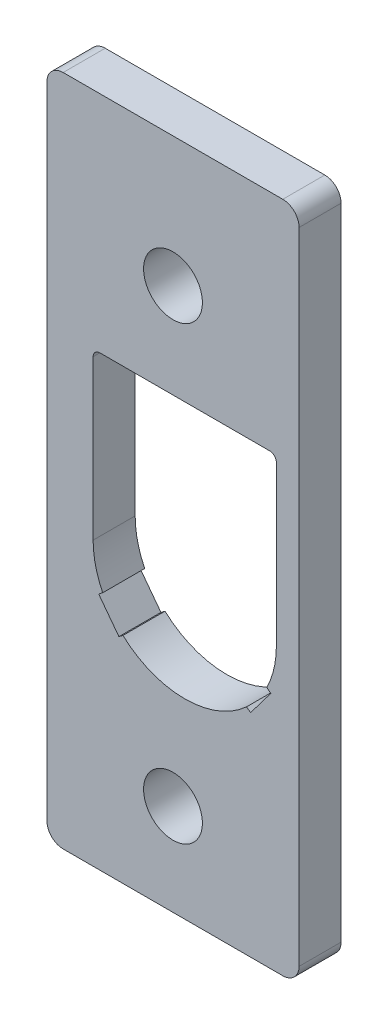
ISO-10303-21;
HEADER;
FILE_DESCRIPTION(('STEP AP214'),'2;1');
FILE_NAME('part.step','',(''),(''),'','','');
FILE_SCHEMA(('AUTOMOTIVE_DESIGN { 1 0 10303 214 1 1 1 1 }'));
ENDSEC;
DATA;
#1=APPLICATION_CONTEXT('core data for automotive mechanical design processes');
#2=APPLICATION_PROTOCOL_DEFINITION('international standard','automotive_design',2000,#1);
#3=PRODUCT_CONTEXT('',#1,'mechanical');
#4=PRODUCT('Part','Part','',(#3));
#5=PRODUCT_RELATED_PRODUCT_CATEGORY('part','',(#4));
#6=PRODUCT_DEFINITION_FORMATION('','',#4);
#7=PRODUCT_DEFINITION_CONTEXT('part definition',#1,'design');
#8=PRODUCT_DEFINITION('design','',#6,#7);
#9=PRODUCT_DEFINITION_SHAPE('','',#8);
#10=(LENGTH_UNIT() NAMED_UNIT(*) SI_UNIT(.MILLI.,.METRE.));
#11=(NAMED_UNIT(*) PLANE_ANGLE_UNIT() SI_UNIT($,.RADIAN.));
#12=(NAMED_UNIT(*) SI_UNIT($,.STERADIAN.) SOLID_ANGLE_UNIT());
#13=UNCERTAINTY_MEASURE_WITH_UNIT(LENGTH_MEASURE(1.E-05),#10,'distance_accuracy_value','');
#14=(GEOMETRIC_REPRESENTATION_CONTEXT(3) GLOBAL_UNCERTAINTY_ASSIGNED_CONTEXT((#13)) GLOBAL_UNIT_ASSIGNED_CONTEXT((#10,
#11,#12)) REPRESENTATION_CONTEXT('',''));
#15=CARTESIAN_POINT('',(0.,0.,0.));
#16=DIRECTION('',(0.,0.,1.));
#17=DIRECTION('',(1.,0.,0.));
#18=AXIS2_PLACEMENT_3D('',#15,#16,#17);
#19=CARTESIAN_POINT('',(-20.828,0.,6.35));
#20=DIRECTION('',(-1.,0.,0.));
#21=DIRECTION('',(0.,-1.,0.));
#22=AXIS2_PLACEMENT_3D('',#19,#20,#21);
#23=PLANE('',#22);
#24=DIRECTION('',(0.,1.,0.));
#25=VECTOR('',#24,1.);
#26=CARTESIAN_POINT('',(-20.828,0.,0.));
#27=LINE('',#26,#25);
#28=CARTESIAN_POINT('',(-20.828,-40.2119999999997,0.));
#29=VERTEX_POINT('',#28);
#30=CARTESIAN_POINT('',(-20.828,56.4680000000002,0.));
#31=VERTEX_POINT('',#30);
#32=EDGE_CURVE('E289',#29,#31,#27,.T.);
#33=ORIENTED_EDGE('',*,*,#32,.F.);
#34=DIRECTION('',(0.,0.,-1.));
#35=VECTOR('',#34,1.);
#36=CARTESIAN_POINT('',(-20.828,-40.2119999999997,6.35));
#37=LINE('',#36,#35);
#38=CARTESIAN_POINT('',(-20.828,-40.2119999999997,6.35));
#39=VERTEX_POINT('',#38);
#40=EDGE_CURVE('E11',#29,#39,#37,.F.);
#41=ORIENTED_EDGE('',*,*,#40,.T.);
#42=DIRECTION('',(0.,1.,0.));
#43=VECTOR('',#42,1.);
#44=CARTESIAN_POINT('',(-20.828,0.,6.35));
#45=LINE('',#44,#43);
#46=CARTESIAN_POINT('',(-20.828,56.4680000000002,6.35));
#47=VERTEX_POINT('',#46);
#48=EDGE_CURVE('E245',#39,#47,#45,.T.);
#49=ORIENTED_EDGE('',*,*,#48,.T.);
#50=DIRECTION('',(0.,0.,-1.));
#51=VECTOR('',#50,1.);
#52=CARTESIAN_POINT('',(-20.828,56.4680000000002,0.));
#53=LINE('',#52,#51);
#54=EDGE_CURVE('E45',#47,#31,#53,.T.);
#55=ORIENTED_EDGE('',*,*,#54,.T.);
#56=EDGE_LOOP('',(#33,#41,#49,#55));
#57=FACE_BOUND('',#56,.T.);
#58=ADVANCED_FACE('F37',(#57),#23,.T.);
#59=CARTESIAN_POINT('',(0.,-42.6719999999997,6.35));
#60=DIRECTION('',(0.,-1.,0.));
#61=DIRECTION('',(1.,0.,0.));
#62=AXIS2_PLACEMENT_3D('',#59,#60,#61);
#63=PLANE('',#62);
#64=DIRECTION('',(-1.,0.,0.));
#65=VECTOR('',#64,1.);
#66=CARTESIAN_POINT('',(0.,-42.6719999999997,0.));
#67=LINE('',#66,#65);
#68=CARTESIAN_POINT('',(14.8120000000001,-42.6719999999997,0.));
#69=VERTEX_POINT('',#68);
#70=CARTESIAN_POINT('',(-18.368,-42.6719999999997,0.));
#71=VERTEX_POINT('',#70);
#72=EDGE_CURVE('E292',#69,#71,#67,.T.);
#73=ORIENTED_EDGE('',*,*,#72,.F.);
#74=DIRECTION('',(0.,0.,-1.));
#75=VECTOR('',#74,1.);
#76=CARTESIAN_POINT('',(14.8120000000001,-42.6719999999997,6.35));
#77=LINE('',#76,#75);
#78=CARTESIAN_POINT('',(14.8120000000001,-42.6719999999997,6.35));
#79=VERTEX_POINT('',#78);
#80=EDGE_CURVE('E59',#69,#79,#77,.F.);
#81=ORIENTED_EDGE('',*,*,#80,.T.);
#82=DIRECTION('',(-1.,0.,0.));
#83=VECTOR('',#82,1.);
#84=CARTESIAN_POINT('',(0.,-42.6719999999997,6.35));
#85=LINE('',#84,#83);
#86=CARTESIAN_POINT('',(-18.368,-42.6719999999997,6.35));
#87=VERTEX_POINT('',#86);
#88=EDGE_CURVE('E248',#79,#87,#85,.T.);
#89=ORIENTED_EDGE('',*,*,#88,.T.);
#90=DIRECTION('',(0.,0.,-1.));
#91=VECTOR('',#90,1.);
#92=CARTESIAN_POINT('',(-18.368,-42.6719999999997,6.35));
#93=LINE('',#92,#91);
#94=EDGE_CURVE('E356',#87,#71,#93,.T.);
#95=ORIENTED_EDGE('',*,*,#94,.T.);
#96=EDGE_LOOP('',(#73,#81,#89,#95));
#97=FACE_BOUND('',#96,.T.);
#98=ADVANCED_FACE('F372',(#97),#63,.T.);
#99=CARTESIAN_POINT('',(17.2720000000001,0.,6.35));
#100=DIRECTION('',(-1.,0.,0.));
#101=DIRECTION('',(0.,0.,1.));
#102=AXIS2_PLACEMENT_3D('',#99,#100,#101);
#103=PLANE('',#102);
#104=DIRECTION('',(0.,1.,0.));
#105=VECTOR('',#104,1.);
#106=CARTESIAN_POINT('',(17.2720000000001,0.,0.));
#107=LINE('',#106,#105);
#108=CARTESIAN_POINT('',(17.2720000000001,-40.2119999999997,0.));
#109=VERTEX_POINT('',#108);
#110=CARTESIAN_POINT('',(17.2720000000001,56.4680000000003,0.));
#111=VERTEX_POINT('',#110);
#112=EDGE_CURVE('E215',#109,#111,#107,.T.);
#113=ORIENTED_EDGE('',*,*,#112,.T.);
#114=DIRECTION('',(0.,0.,-1.));
#115=VECTOR('',#114,1.);
#116=CARTESIAN_POINT('',(17.2720000000001,56.4680000000003,6.35));
#117=LINE('',#116,#115);
#118=CARTESIAN_POINT('',(17.2720000000001,56.4680000000003,6.35));
#119=VERTEX_POINT('',#118);
#120=EDGE_CURVE('E347',#111,#119,#117,.F.);
#121=ORIENTED_EDGE('',*,*,#120,.T.);
#122=DIRECTION('',(0.,1.,0.));
#123=VECTOR('',#122,1.);
#124=CARTESIAN_POINT('',(17.2720000000001,0.,6.35));
#125=LINE('',#124,#123);
#126=CARTESIAN_POINT('',(17.2720000000001,-40.2119999999997,6.35));
#127=VERTEX_POINT('',#126);
#128=EDGE_CURVE('E250',#127,#119,#125,.T.);
#129=ORIENTED_EDGE('',*,*,#128,.F.);
#130=DIRECTION('',(0.,0.,-1.));
#131=VECTOR('',#130,1.);
#132=CARTESIAN_POINT('',(17.2720000000001,-40.2119999999997,0.));
#133=LINE('',#132,#131);
#134=EDGE_CURVE('E344',#127,#109,#133,.T.);
#135=ORIENTED_EDGE('',*,*,#134,.T.);
#136=EDGE_LOOP('',(#113,#121,#129,#135));
#137=FACE_BOUND('',#136,.T.);
#138=ADVANCED_FACE('F380',(#137),#103,.F.);
#139=CARTESIAN_POINT('',(0.,0.,6.35));
#140=DIRECTION('',(0.,0.,-1.));
#141=DIRECTION('',(-1.,0.,0.));
#142=AXIS2_PLACEMENT_3D('',#139,#140,#141);
#143=CYLINDRICAL_SURFACE('',#142,13.843);
#144=CARTESIAN_POINT('',(0.,0.,0.));
#145=DIRECTION('',(0.,0.,1.));
#146=DIRECTION('',(1.,0.,0.));
#147=AXIS2_PLACEMENT_3D('',#144,#145,#146);
#148=CIRCLE('',#147,13.843);
#149=CARTESIAN_POINT('',(12.3964241327467,-6.16095104030657,0.));
#150=VERTEX_POINT('',#149);
#151=CARTESIAN_POINT('',(13.843,0.,0.));
#152=VERTEX_POINT('',#151);
#153=EDGE_CURVE('E194',#150,#152,#148,.T.);
#154=ORIENTED_EDGE('',*,*,#153,.F.);
#155=DIRECTION('',(0.,0.,-1.));
#156=VECTOR('',#155,1.);
#157=CARTESIAN_POINT('',(12.3964241327467,-6.16095104030657,6.35));
#158=LINE('',#157,#156);
#159=CARTESIAN_POINT('',(12.3964241327467,-6.16095104030657,6.35));
#160=VERTEX_POINT('',#159);
#161=EDGE_CURVE('E187',#160,#150,#158,.T.);
#162=ORIENTED_EDGE('',*,*,#161,.F.);
#163=CARTESIAN_POINT('',(0.,0.,6.35));
#164=DIRECTION('',(0.,0.,1.));
#165=DIRECTION('',(1.,0.,0.));
#166=AXIS2_PLACEMENT_3D('',#163,#164,#165);
#167=CIRCLE('',#166,13.843);
#168=CARTESIAN_POINT('',(13.843,0.,6.35));
#169=VERTEX_POINT('',#168);
#170=EDGE_CURVE('E191',#160,#169,#167,.T.);
#171=ORIENTED_EDGE('',*,*,#170,.T.);
#172=DIRECTION('',(0.,0.,-1.));
#173=VECTOR('',#172,1.);
#174=CARTESIAN_POINT('',(13.843,0.,6.35));
#175=LINE('',#174,#173);
#176=EDGE_CURVE('E256',#169,#152,#175,.T.);
#177=ORIENTED_EDGE('',*,*,#176,.T.);
#178=EDGE_LOOP('',(#154,#162,#171,#177));
#179=FACE_BOUND('',#178,.T.);
#180=ADVANCED_FACE('F189',(#179),#143,.F.);
#181=CARTESIAN_POINT('',(1.52861015881476,2.02853419552793,6.35));
#182=DIRECTION('',(0.60181502315272,0.798635510046787,0.));
#183=DIRECTION('',(-0.798635510046787,0.60181502315272,0.));
#184=AXIS2_PLACEMENT_3D('',#181,#182,#183);
#185=PLANE('',#184);
#186=DIRECTION('',(0.798635510046787,-0.60181502315272,0.));
#187=VECTOR('',#186,1.);
#188=CARTESIAN_POINT('',(1.52861015881476,2.02853419552793,0.));
#189=LINE('',#188,#187);
#190=CARTESIAN_POINT('',(13.0049843914024,-6.61953408794895,0.));
#191=VERTEX_POINT('',#190);
#192=EDGE_CURVE('E258',#150,#191,#189,.T.);
#193=ORIENTED_EDGE('',*,*,#192,.T.);
#194=DIRECTION('',(0.,0.,-1.));
#195=VECTOR('',#194,1.);
#196=CARTESIAN_POINT('',(13.0049843914024,-6.61953408794895,6.35));
#197=LINE('',#196,#195);
#198=CARTESIAN_POINT('',(13.0049843914024,-6.61953408794895,6.35));
#199=VERTEX_POINT('',#198);
#200=EDGE_CURVE('E199',#199,#191,#197,.T.);
#201=ORIENTED_EDGE('',*,*,#200,.F.);
#202=DIRECTION('',(0.798635510046787,-0.60181502315272,0.));
#203=VECTOR('',#202,1.);
#204=CARTESIAN_POINT('',(1.52861015881476,2.02853419552793,6.35));
#205=LINE('',#204,#203);
#206=EDGE_CURVE('E202',#160,#199,#205,.T.);
#207=ORIENTED_EDGE('',*,*,#206,.F.);
#208=ORIENTED_EDGE('',*,*,#161,.T.);
#209=EDGE_LOOP('',(#193,#201,#207,#208));
#210=FACE_BOUND('',#209,.T.);
#211=ADVANCED_FACE('F203',(#210),#185,.F.);
#212=CARTESIAN_POINT('',(11.4763742325965,-8.64806828346858,6.35));
#213=DIRECTION('',(-0.798635510047289,0.601815023152054,0.));
#214=DIRECTION('',(-0.601815023152054,-0.798635510047289,0.));
#215=AXIS2_PLACEMENT_3D('',#212,#213,#214);
#216=PLANE('',#215);
#217=DIRECTION('',(0.601815023152054,0.798635510047289,0.));
#218=VECTOR('',#217,1.);
#219=CARTESIAN_POINT('',(11.4763742325965,-8.64806828346858,0.));
#220=LINE('',#219,#218);
#221=CARTESIAN_POINT('',(9.94776407378995,-10.6766024789892,0.));
#222=VERTEX_POINT('',#221);
#223=EDGE_CURVE('E260',#222,#191,#220,.T.);
#224=ORIENTED_EDGE('',*,*,#223,.F.);
#225=DIRECTION('',(0.,0.,-1.));
#226=VECTOR('',#225,1.);
#227=CARTESIAN_POINT('',(9.94776407378995,-10.6766024789892,6.35));
#228=LINE('',#227,#226);
#229=CARTESIAN_POINT('',(9.94776407378995,-10.6766024789892,6.35));
#230=VERTEX_POINT('',#229);
#231=EDGE_CURVE('E311',#230,#222,#228,.T.);
#232=ORIENTED_EDGE('',*,*,#231,.F.);
#233=DIRECTION('',(0.601815023152054,0.798635510047289,0.));
#234=VECTOR('',#233,1.);
#235=CARTESIAN_POINT('',(11.4763742325965,-8.64806828346858,6.35));
#236=LINE('',#235,#234);
#237=EDGE_CURVE('E207',#230,#199,#236,.T.);
#238=ORIENTED_EDGE('',*,*,#237,.T.);
#239=ORIENTED_EDGE('',*,*,#200,.T.);
#240=EDGE_LOOP('',(#224,#232,#238,#239));
#241=FACE_BOUND('',#240,.T.);
#242=ADVANCED_FACE('F437',(#241),#216,.T.);
#243=CARTESIAN_POINT('',(-1.52861015880656,-2.02853419552056,6.35));
#244=DIRECTION('',(0.601815023152056,0.798635510047287,0.));
#245=DIRECTION('',(-0.798635510047287,0.601815023152056,0.));
#246=AXIS2_PLACEMENT_3D('',#243,#244,#245);
#247=PLANE('',#246);
#248=DIRECTION('',(0.798635510047287,-0.601815023152056,0.));
#249=VECTOR('',#248,1.);
#250=CARTESIAN_POINT('',(-1.52861015880656,-2.02853419552056,0.));
#251=LINE('',#250,#249);
#252=CARTESIAN_POINT('',(9.33920381513392,-10.2180194313473,0.));
#253=VERTEX_POINT('',#252);
#254=EDGE_CURVE('E263',#253,#222,#251,.T.);
#255=ORIENTED_EDGE('',*,*,#254,.F.);
#256=DIRECTION('',(0.,0.,-1.));
#257=VECTOR('',#256,1.);
#258=CARTESIAN_POINT('',(9.33920381513392,-10.2180194313473,6.35));
#259=LINE('',#258,#257);
#260=CARTESIAN_POINT('',(9.33920381513392,-10.2180194313473,6.35));
#261=VERTEX_POINT('',#260);
#262=EDGE_CURVE('E309',#261,#253,#259,.T.);
#263=ORIENTED_EDGE('',*,*,#262,.F.);
#264=DIRECTION('',(0.798635510047287,-0.601815023152056,0.));
#265=VECTOR('',#264,1.);
#266=CARTESIAN_POINT('',(-1.52861015880656,-2.02853419552056,6.35));
#267=LINE('',#266,#265);
#268=EDGE_CURVE('E222',#261,#230,#267,.T.);
#269=ORIENTED_EDGE('',*,*,#268,.T.);
#270=ORIENTED_EDGE('',*,*,#231,.T.);
#271=EDGE_LOOP('',(#255,#263,#269,#270));
#272=FACE_BOUND('',#271,.T.);
#273=ADVANCED_FACE('F433',(#272),#247,.T.);
#274=CARTESIAN_POINT('',(0.,0.,6.35));
#275=DIRECTION('',(0.,0.,-1.));
#276=DIRECTION('',(-1.,0.,0.));
#277=AXIS2_PLACEMENT_3D('',#274,#275,#276);
#278=CYLINDRICAL_SURFACE('',#277,13.8430000000001);
#279=CARTESIAN_POINT('',(0.,0.,0.));
#280=DIRECTION('',(0.,0.,1.));
#281=DIRECTION('',(1.,0.,0.));
#282=AXIS2_PLACEMENT_3D('',#279,#280,#281);
#283=CIRCLE('',#282,13.8430000000001);
#284=CARTESIAN_POINT('',(-9.33920381513427,-10.2180194313468,0.));
#285=VERTEX_POINT('',#284);
#286=EDGE_CURVE('E266',#285,#253,#283,.T.);
#287=ORIENTED_EDGE('',*,*,#286,.F.);
#288=DIRECTION('',(0.,0.,-1.));
#289=VECTOR('',#288,1.);
#290=CARTESIAN_POINT('',(-9.33920381513427,-10.2180194313468,6.35));
#291=LINE('',#290,#289);
#292=CARTESIAN_POINT('',(-9.33920381513427,-10.2180194313468,6.35));
#293=VERTEX_POINT('',#292);
#294=EDGE_CURVE('E307',#293,#285,#291,.T.);
#295=ORIENTED_EDGE('',*,*,#294,.F.);
#296=CARTESIAN_POINT('',(0.,0.,6.35));
#297=DIRECTION('',(0.,0.,1.));
#298=DIRECTION('',(1.,0.,0.));
#299=AXIS2_PLACEMENT_3D('',#296,#297,#298);
#300=CIRCLE('',#299,13.8430000000001);
#301=EDGE_CURVE('E225',#293,#261,#300,.T.);
#302=ORIENTED_EDGE('',*,*,#301,.T.);
#303=ORIENTED_EDGE('',*,*,#262,.T.);
#304=EDGE_LOOP('',(#287,#295,#302,#303));
#305=FACE_BOUND('',#304,.T.);
#306=ADVANCED_FACE('F429',(#305),#278,.F.);
#307=CARTESIAN_POINT('',(1.52861015880624,-2.02853419552015,6.35));
#308=DIRECTION('',(0.601815023152052,-0.79863551004729,0.));
#309=DIRECTION('',(0.79863551004729,0.601815023152052,0.));
#310=AXIS2_PLACEMENT_3D('',#307,#308,#309);
#311=PLANE('',#310);
#312=DIRECTION('',(-0.79863551004729,-0.601815023152052,0.));
#313=VECTOR('',#312,1.);
#314=CARTESIAN_POINT('',(1.52861015880624,-2.02853419552015,0.));
#315=LINE('',#314,#313);
#316=CARTESIAN_POINT('',(-9.9477640737903,-10.6766024789887,0.));
#317=VERTEX_POINT('',#316);
#318=EDGE_CURVE('E269',#285,#317,#315,.T.);
#319=ORIENTED_EDGE('',*,*,#318,.T.);
#320=DIRECTION('',(0.,0.,-1.));
#321=VECTOR('',#320,1.);
#322=CARTESIAN_POINT('',(-9.9477640737903,-10.6766024789887,6.35));
#323=LINE('',#322,#321);
#324=CARTESIAN_POINT('',(-9.9477640737903,-10.6766024789887,6.35));
#325=VERTEX_POINT('',#324);
#326=EDGE_CURVE('E305',#325,#317,#323,.T.);
#327=ORIENTED_EDGE('',*,*,#326,.F.);
#328=DIRECTION('',(-0.79863551004729,-0.601815023152052,0.));
#329=VECTOR('',#328,1.);
#330=CARTESIAN_POINT('',(1.52861015880624,-2.02853419552015,6.35));
#331=LINE('',#330,#329);
#332=EDGE_CURVE('E228',#293,#325,#331,.T.);
#333=ORIENTED_EDGE('',*,*,#332,.F.);
#334=ORIENTED_EDGE('',*,*,#294,.T.);
#335=EDGE_LOOP('',(#319,#327,#333,#334));
#336=FACE_BOUND('',#335,.T.);
#337=ADVANCED_FACE('F425',(#336),#311,.F.);
#338=CARTESIAN_POINT('',(-11.4763742325965,-8.64806828346857,6.35));
#339=DIRECTION('',(0.798635510047289,0.601815023152053,0.));
#340=DIRECTION('',(-0.601815023152053,0.798635510047289,0.));
#341=AXIS2_PLACEMENT_3D('',#338,#339,#340);
#342=PLANE('',#341);
#343=DIRECTION('',(0.601815023152053,-0.798635510047289,0.));
#344=VECTOR('',#343,1.);
#345=CARTESIAN_POINT('',(-11.4763742325965,-8.64806828346857,0.));
#346=LINE('',#345,#344);
#347=CARTESIAN_POINT('',(-13.0049843914027,-6.61953408794847,0.));
#348=VERTEX_POINT('',#347);
#349=EDGE_CURVE('E272',#348,#317,#346,.T.);
#350=ORIENTED_EDGE('',*,*,#349,.F.);
#351=DIRECTION('',(0.,0.,-1.));
#352=VECTOR('',#351,1.);
#353=CARTESIAN_POINT('',(-13.0049843914027,-6.61953408794847,6.35));
#354=LINE('',#353,#352);
#355=CARTESIAN_POINT('',(-13.0049843914027,-6.61953408794847,6.35));
#356=VERTEX_POINT('',#355);
#357=EDGE_CURVE('E303',#356,#348,#354,.T.);
#358=ORIENTED_EDGE('',*,*,#357,.F.);
#359=DIRECTION('',(0.601815023152053,-0.798635510047289,0.));
#360=VECTOR('',#359,1.);
#361=CARTESIAN_POINT('',(-11.4763742325965,-8.64806828346857,6.35));
#362=LINE('',#361,#360);
#363=EDGE_CURVE('E230',#356,#325,#362,.T.);
#364=ORIENTED_EDGE('',*,*,#363,.T.);
#365=ORIENTED_EDGE('',*,*,#326,.T.);
#366=EDGE_LOOP('',(#350,#358,#364,#365));
#367=FACE_BOUND('',#366,.T.);
#368=ADVANCED_FACE('F421',(#367),#342,.T.);
#369=CARTESIAN_POINT('',(-1.5286101588062,2.02853419552009,6.35));
#370=DIRECTION('',(0.601815023152053,-0.798635510047289,0.));
#371=DIRECTION('',(0.79863551004729,0.601815023152053,0.));
#372=AXIS2_PLACEMENT_3D('',#369,#370,#371);
#373=PLANE('',#372);
#374=DIRECTION('',(-0.798635510047289,-0.601815023152053,0.));
#375=VECTOR('',#374,1.);
#376=CARTESIAN_POINT('',(-1.5286101588062,2.02853419552009,0.));
#377=LINE('',#376,#375);
#378=CARTESIAN_POINT('',(-12.3964241327467,-6.16095104030661,0.));
#379=VERTEX_POINT('',#378);
#380=EDGE_CURVE('E275',#379,#348,#377,.T.);
#381=ORIENTED_EDGE('',*,*,#380,.F.);
#382=DIRECTION('',(0.,0.,-1.));
#383=VECTOR('',#382,1.);
#384=CARTESIAN_POINT('',(-12.3964241327467,-6.16095104030661,6.35));
#385=LINE('',#384,#383);
#386=CARTESIAN_POINT('',(-12.3964241327467,-6.16095104030661,6.35));
#387=VERTEX_POINT('',#386);
#388=EDGE_CURVE('E301',#387,#379,#385,.T.);
#389=ORIENTED_EDGE('',*,*,#388,.F.);
#390=DIRECTION('',(-0.798635510047289,-0.601815023152053,0.));
#391=VECTOR('',#390,1.);
#392=CARTESIAN_POINT('',(-1.5286101588062,2.02853419552009,6.35));
#393=LINE('',#392,#391);
#394=EDGE_CURVE('E233',#387,#356,#393,.T.);
#395=ORIENTED_EDGE('',*,*,#394,.T.);
#396=ORIENTED_EDGE('',*,*,#357,.T.);
#397=EDGE_LOOP('',(#381,#389,#395,#396));
#398=FACE_BOUND('',#397,.T.);
#399=ADVANCED_FACE('F417',(#398),#373,.T.);
#400=CARTESIAN_POINT('',(0.,0.,6.35));
#401=DIRECTION('',(0.,0.,-1.));
#402=DIRECTION('',(-1.,0.,0.));
#403=AXIS2_PLACEMENT_3D('',#400,#401,#402);
#404=CYLINDRICAL_SURFACE('',#403,13.843);
#405=CARTESIAN_POINT('',(0.,0.,0.));
#406=DIRECTION('',(0.,0.,1.));
#407=DIRECTION('',(1.,0.,0.));
#408=AXIS2_PLACEMENT_3D('',#405,#406,#407);
#409=CIRCLE('',#408,13.843);
#410=CARTESIAN_POINT('',(-13.843,0.,0.));
#411=VERTEX_POINT('',#410);
#412=EDGE_CURVE('E278',#411,#379,#409,.T.);
#413=ORIENTED_EDGE('',*,*,#412,.F.);
#414=DIRECTION('',(0.,0.,-1.));
#415=VECTOR('',#414,1.);
#416=CARTESIAN_POINT('',(-13.843,0.,6.35));
#417=LINE('',#416,#415);
#418=CARTESIAN_POINT('',(-13.843,0.,6.35));
#419=VERTEX_POINT('',#418);
#420=EDGE_CURVE('E298',#419,#411,#417,.T.);
#421=ORIENTED_EDGE('',*,*,#420,.F.);
#422=CARTESIAN_POINT('',(0.,0.,6.35));
#423=DIRECTION('',(0.,0.,1.));
#424=DIRECTION('',(1.,0.,0.));
#425=AXIS2_PLACEMENT_3D('',#422,#423,#424);
#426=CIRCLE('',#425,13.843);
#427=EDGE_CURVE('E236',#419,#387,#426,.T.);
#428=ORIENTED_EDGE('',*,*,#427,.T.);
#429=ORIENTED_EDGE('',*,*,#388,.T.);
#430=EDGE_LOOP('',(#413,#421,#428,#429));
#431=FACE_BOUND('',#430,.T.);
#432=ADVANCED_FACE('F413',(#431),#404,.F.);
#433=CARTESIAN_POINT('',(-13.843,0.,6.35));
#434=DIRECTION('',(1.,0.,0.));
#435=DIRECTION('',(0.,1.,0.));
#436=AXIS2_PLACEMENT_3D('',#433,#434,#435);
#437=PLANE('',#436);
#438=DIRECTION('',(0.,-1.,0.));
#439=VECTOR('',#438,1.);
#440=CARTESIAN_POINT('',(-13.843,0.,0.));
#441=LINE('',#440,#439);
#442=CARTESIAN_POINT('',(-13.843,24.003,0.));
#443=VERTEX_POINT('',#442);
#444=EDGE_CURVE('E281',#443,#411,#441,.T.);
#445=ORIENTED_EDGE('',*,*,#444,.F.);
#446=DIRECTION('',(0.,0.,-1.));
#447=VECTOR('',#446,1.);
#448=CARTESIAN_POINT('',(-13.843,24.003,6.35));
#449=LINE('',#448,#447);
#450=CARTESIAN_POINT('',(-13.843,24.003,6.35));
#451=VERTEX_POINT('',#450);
#452=EDGE_CURVE('E321',#443,#451,#449,.F.);
#453=ORIENTED_EDGE('',*,*,#452,.T.);
#454=DIRECTION('',(0.,-1.,0.));
#455=VECTOR('',#454,1.);
#456=CARTESIAN_POINT('',(-13.843,0.,6.35));
#457=LINE('',#456,#455);
#458=EDGE_CURVE('E239',#451,#419,#457,.T.);
#459=ORIENTED_EDGE('',*,*,#458,.T.);
#460=ORIENTED_EDGE('',*,*,#420,.T.);
#461=EDGE_LOOP('',(#445,#453,#459,#460));
#462=FACE_BOUND('',#461,.T.);
#463=ADVANCED_FACE('F409',(#462),#437,.T.);
#464=CARTESIAN_POINT('',(0.,25.019,6.35));
#465=DIRECTION('',(0.,1.,0.));
#466=DIRECTION('',(-1.,0.,0.));
#467=AXIS2_PLACEMENT_3D('',#464,#465,#466);
#468=PLANE('',#467);
#469=DIRECTION('',(1.,0.,0.));
#470=VECTOR('',#469,1.);
#471=CARTESIAN_POINT('',(0.,25.019,0.));
#472=LINE('',#471,#470);
#473=CARTESIAN_POINT('',(-12.827,25.019,0.));
#474=VERTEX_POINT('',#473);
#475=CARTESIAN_POINT('',(12.827,25.019,0.));
#476=VERTEX_POINT('',#475);
#477=EDGE_CURVE('E283',#474,#476,#472,.T.);
#478=ORIENTED_EDGE('',*,*,#477,.T.);
#479=DIRECTION('',(0.,0.,-1.));
#480=VECTOR('',#479,1.);
#481=CARTESIAN_POINT('',(12.827,25.019,6.35));
#482=LINE('',#481,#480);
#483=CARTESIAN_POINT('',(12.827,25.019,6.35));
#484=VERTEX_POINT('',#483);
#485=EDGE_CURVE('E319',#476,#484,#482,.F.);
#486=ORIENTED_EDGE('',*,*,#485,.T.);
#487=DIRECTION('',(1.,0.,0.));
#488=VECTOR('',#487,1.);
#489=CARTESIAN_POINT('',(0.,25.019,6.35));
#490=LINE('',#489,#488);
#491=CARTESIAN_POINT('',(-12.827,25.019,6.35));
#492=VERTEX_POINT('',#491);
#493=EDGE_CURVE('E241',#492,#484,#490,.T.);
#494=ORIENTED_EDGE('',*,*,#493,.F.);
#495=DIRECTION('',(0.,0.,-1.));
#496=VECTOR('',#495,1.);
#497=CARTESIAN_POINT('',(-12.827,25.019,6.35));
#498=LINE('',#497,#496);
#499=EDGE_CURVE('E316',#492,#474,#498,.T.);
#500=ORIENTED_EDGE('',*,*,#499,.T.);
#501=EDGE_LOOP('',(#478,#486,#494,#500));
#502=FACE_BOUND('',#501,.T.);
#503=ADVANCED_FACE('F405',(#502),#468,.F.);
#504=CARTESIAN_POINT('',(13.843,0.,6.35));
#505=DIRECTION('',(-1.,0.,0.));
#506=DIRECTION('',(0.,-1.,0.));
#507=AXIS2_PLACEMENT_3D('',#504,#505,#506);
#508=PLANE('',#507);
#509=DIRECTION('',(0.,1.,0.));
#510=VECTOR('',#509,1.);
#511=CARTESIAN_POINT('',(13.843,0.,6.35));
#512=LINE('',#511,#510);
#513=CARTESIAN_POINT('',(13.843,24.003,6.35));
#514=VERTEX_POINT('',#513);
#515=EDGE_CURVE('E211',#169,#514,#512,.T.);
#516=ORIENTED_EDGE('',*,*,#515,.T.);
#517=DIRECTION('',(0.,0.,-1.));
#518=VECTOR('',#517,1.);
#519=CARTESIAN_POINT('',(13.843,24.003,6.35));
#520=LINE('',#519,#518);
#521=CARTESIAN_POINT('',(13.843,24.003,0.));
#522=VERTEX_POINT('',#521);
#523=EDGE_CURVE('E198',#514,#522,#520,.T.);
#524=ORIENTED_EDGE('',*,*,#523,.T.);
#525=DIRECTION('',(0.,1.,0.));
#526=VECTOR('',#525,1.);
#527=CARTESIAN_POINT('',(13.843,0.,0.));
#528=LINE('',#527,#526);
#529=EDGE_CURVE('E286',#152,#522,#528,.T.);
#530=ORIENTED_EDGE('',*,*,#529,.F.);
#531=ORIENTED_EDGE('',*,*,#176,.F.);
#532=EDGE_LOOP('',(#516,#524,#530,#531));
#533=FACE_BOUND('',#532,.T.);
#534=ADVANCED_FACE('F402',(#533),#508,.T.);
#535=CARTESIAN_POINT('',(0.,58.9280000000003,6.35));
#536=DIRECTION('',(0.,-1.,0.));
#537=DIRECTION('',(1.,0.,0.));
#538=AXIS2_PLACEMENT_3D('',#535,#536,#537);
#539=PLANE('',#538);
#540=DIRECTION('',(-1.,0.,0.));
#541=VECTOR('',#540,1.);
#542=CARTESIAN_POINT('',(0.,58.9280000000003,6.35));
#543=LINE('',#542,#541);
#544=CARTESIAN_POINT('',(14.8120000000001,58.9280000000003,6.35));
#545=VERTEX_POINT('',#544);
#546=CARTESIAN_POINT('',(-18.368,58.9280000000002,6.35));
#547=VERTEX_POINT('',#546);
#548=EDGE_CURVE('E253',#545,#547,#543,.T.);
#549=ORIENTED_EDGE('',*,*,#548,.F.);
#550=DIRECTION('',(0.,0.,-1.));
#551=VECTOR('',#550,1.);
#552=CARTESIAN_POINT('',(14.8120000000001,58.9280000000003,6.35));
#553=LINE('',#552,#551);
#554=CARTESIAN_POINT('',(14.8120000000001,58.9280000000003,0.));
#555=VERTEX_POINT('',#554);
#556=EDGE_CURVE('E333',#545,#555,#553,.T.);
#557=ORIENTED_EDGE('',*,*,#556,.T.);
#558=DIRECTION('',(-1.,0.,0.));
#559=VECTOR('',#558,1.);
#560=CARTESIAN_POINT('',(0.,58.9280000000003,0.));
#561=LINE('',#560,#559);
#562=CARTESIAN_POINT('',(-18.368,58.9280000000002,0.));
#563=VERTEX_POINT('',#562);
#564=EDGE_CURVE('E212',#555,#563,#561,.T.);
#565=ORIENTED_EDGE('',*,*,#564,.T.);
#566=DIRECTION('',(0.,0.,-1.));
#567=VECTOR('',#566,1.);
#568=CARTESIAN_POINT('',(-18.368,58.9280000000002,6.35));
#569=LINE('',#568,#567);
#570=EDGE_CURVE('E331',#563,#547,#569,.F.);
#571=ORIENTED_EDGE('',*,*,#570,.T.);
#572=EDGE_LOOP('',(#549,#557,#565,#571));
#573=FACE_BOUND('',#572,.T.);
#574=ADVANCED_FACE('F388',(#573),#539,.F.);
#575=CARTESIAN_POINT('',(0.,0.,6.35));
#576=DIRECTION('',(0.,0.,1.));
#577=DIRECTION('',(1.,0.,0.));
#578=AXIS2_PLACEMENT_3D('',#575,#576,#577);
#579=PLANE('',#578);
#580=CARTESIAN_POINT('',(-1.77799999999995,-28.7813749999997,6.35));
#581=DIRECTION('',(0.,0.,1.));
#582=DIRECTION('',(1.,0.,0.));
#583=AXIS2_PLACEMENT_3D('',#580,#581,#582);
#584=CIRCLE('',#583,4.445);
#585=CARTESIAN_POINT('',(2.66700000000005,-28.7813749999997,6.35));
#586=VERTEX_POINT('',#585);
#587=EDGE_CURVE('E632',#586,#586,#584,.T.);
#588=ORIENTED_EDGE('',*,*,#587,.F.);
#589=EDGE_LOOP('',(#588));
#590=FACE_BOUND('',#589,.T.);
#591=CARTESIAN_POINT('',(-1.77799999999995,39.3223750000002,6.35));
#592=DIRECTION('',(0.,0.,1.));
#593=DIRECTION('',(1.,0.,0.));
#594=AXIS2_PLACEMENT_3D('',#591,#592,#593);
#595=CIRCLE('',#594,4.445);
#596=CARTESIAN_POINT('',(2.66700000000005,39.3223750000002,6.35));
#597=VERTEX_POINT('',#596);
#598=EDGE_CURVE('E635',#597,#597,#595,.T.);
#599=ORIENTED_EDGE('',*,*,#598,.F.);
#600=EDGE_LOOP('',(#599));
#601=FACE_BOUND('',#600,.T.);
#602=ORIENTED_EDGE('',*,*,#170,.F.);
#603=ORIENTED_EDGE('',*,*,#206,.T.);
#604=ORIENTED_EDGE('',*,*,#237,.F.);
#605=ORIENTED_EDGE('',*,*,#268,.F.);
#606=ORIENTED_EDGE('',*,*,#301,.F.);
#607=ORIENTED_EDGE('',*,*,#332,.T.);
#608=ORIENTED_EDGE('',*,*,#363,.F.);
#609=ORIENTED_EDGE('',*,*,#394,.F.);
#610=ORIENTED_EDGE('',*,*,#427,.F.);
#611=ORIENTED_EDGE('',*,*,#458,.F.);
#612=CARTESIAN_POINT('',(-12.827,24.003,6.35));
#613=DIRECTION('',(0.,0.,1.));
#614=DIRECTION('',(1.,0.,0.));
#615=AXIS2_PLACEMENT_3D('',#612,#613,#614);
#616=CIRCLE('',#615,1.016);
#617=EDGE_CURVE('E329',#451,#492,#616,.F.);
#618=ORIENTED_EDGE('',*,*,#617,.T.);
#619=ORIENTED_EDGE('',*,*,#493,.T.);
#620=CARTESIAN_POINT('',(12.827,24.003,6.35));
#621=DIRECTION('',(0.,0.,1.));
#622=DIRECTION('',(1.,0.,0.));
#623=AXIS2_PLACEMENT_3D('',#620,#621,#622);
#624=CIRCLE('',#623,1.016);
#625=EDGE_CURVE('E325',#484,#514,#624,.F.);
#626=ORIENTED_EDGE('',*,*,#625,.T.);
#627=ORIENTED_EDGE('',*,*,#515,.F.);
#628=EDGE_LOOP('',(#602,#603,#604,#605,#606,#607,#608,#609,#610,#611,#618,#619,#626,#627));
#629=FACE_BOUND('',#628,.T.);
#630=ORIENTED_EDGE('',*,*,#128,.T.);
#631=CARTESIAN_POINT('',(14.8120000000001,56.4680000000003,6.35));
#632=DIRECTION('',(0.,0.,1.));
#633=DIRECTION('',(1.,0.,0.));
#634=AXIS2_PLACEMENT_3D('',#631,#632,#633);
#635=CIRCLE('',#634,2.46);
#636=EDGE_CURVE('E354',#119,#545,#635,.T.);
#637=ORIENTED_EDGE('',*,*,#636,.T.);
#638=ORIENTED_EDGE('',*,*,#548,.T.);
#639=CARTESIAN_POINT('',(-18.368,56.4680000000002,6.35));
#640=DIRECTION('',(0.,0.,1.));
#641=DIRECTION('',(1.,0.,0.));
#642=AXIS2_PLACEMENT_3D('',#639,#640,#641);
#643=CIRCLE('',#642,2.46);
#644=EDGE_CURVE('E349',#547,#47,#643,.T.);
#645=ORIENTED_EDGE('',*,*,#644,.T.);
#646=ORIENTED_EDGE('',*,*,#48,.F.);
#647=CARTESIAN_POINT('',(-18.368,-40.2119999999997,6.35));
#648=DIRECTION('',(0.,0.,1.));
#649=DIRECTION('',(1.,0.,0.));
#650=AXIS2_PLACEMENT_3D('',#647,#648,#649);
#651=CIRCLE('',#650,2.46);
#652=EDGE_CURVE('E52',#39,#87,#651,.T.);
#653=ORIENTED_EDGE('',*,*,#652,.T.);
#654=ORIENTED_EDGE('',*,*,#88,.F.);
#655=CARTESIAN_POINT('',(14.8120000000001,-40.2119999999997,6.35));
#656=DIRECTION('',(0.,0.,1.));
#657=DIRECTION('',(1.,0.,0.));
#658=AXIS2_PLACEMENT_3D('',#655,#656,#657);
#659=CIRCLE('',#658,2.46);
#660=EDGE_CURVE('E352',#79,#127,#659,.T.);
#661=ORIENTED_EDGE('',*,*,#660,.T.);
#662=EDGE_LOOP('',(#630,#637,#638,#645,#646,#653,#654,#661));
#663=FACE_BOUND('',#662,.T.);
#664=ADVANCED_FACE('F209',(#590,#601,#629,#663),#579,.T.);
#665=CARTESIAN_POINT('',(0.,0.,0.));
#666=DIRECTION('',(0.,0.,1.));
#667=DIRECTION('',(1.,0.,0.));
#668=AXIS2_PLACEMENT_3D('',#665,#666,#667);
#669=PLANE('',#668);
#670=CARTESIAN_POINT('',(-1.77799999999995,-28.7813749999997,0.));
#671=DIRECTION('',(0.,0.,1.));
#672=DIRECTION('',(1.,0.,0.));
#673=AXIS2_PLACEMENT_3D('',#670,#671,#672);
#674=CIRCLE('',#673,4.445);
#675=CARTESIAN_POINT('',(2.66700000000005,-28.7813749999997,0.));
#676=VERTEX_POINT('',#675);
#677=EDGE_CURVE('E636',#676,#676,#674,.F.);
#678=ORIENTED_EDGE('',*,*,#677,.F.);
#679=EDGE_LOOP('',(#678));
#680=FACE_BOUND('',#679,.T.);
#681=CARTESIAN_POINT('',(-1.77799999999995,39.3223750000002,0.));
#682=DIRECTION('',(0.,0.,1.));
#683=DIRECTION('',(1.,0.,0.));
#684=AXIS2_PLACEMENT_3D('',#681,#682,#683);
#685=CIRCLE('',#684,4.445);
#686=CARTESIAN_POINT('',(2.66700000000005,39.3223750000002,0.));
#687=VERTEX_POINT('',#686);
#688=EDGE_CURVE('E218',#687,#687,#685,.F.);
#689=ORIENTED_EDGE('',*,*,#688,.F.);
#690=EDGE_LOOP('',(#689));
#691=FACE_BOUND('',#690,.T.);
#692=ORIENTED_EDGE('',*,*,#153,.T.);
#693=ORIENTED_EDGE('',*,*,#529,.T.);
#694=CARTESIAN_POINT('',(12.827,24.003,0.));
#695=DIRECTION('',(0.,0.,1.));
#696=DIRECTION('',(1.,0.,0.));
#697=AXIS2_PLACEMENT_3D('',#694,#695,#696);
#698=CIRCLE('',#697,1.016);
#699=EDGE_CURVE('E323',#522,#476,#698,.T.);
#700=ORIENTED_EDGE('',*,*,#699,.T.);
#701=ORIENTED_EDGE('',*,*,#477,.F.);
#702=CARTESIAN_POINT('',(-12.827,24.003,0.));
#703=DIRECTION('',(0.,0.,1.));
#704=DIRECTION('',(1.,0.,0.));
#705=AXIS2_PLACEMENT_3D('',#702,#703,#704);
#706=CIRCLE('',#705,1.016);
#707=EDGE_CURVE('E327',#474,#443,#706,.T.);
#708=ORIENTED_EDGE('',*,*,#707,.T.);
#709=ORIENTED_EDGE('',*,*,#444,.T.);
#710=ORIENTED_EDGE('',*,*,#412,.T.);
#711=ORIENTED_EDGE('',*,*,#380,.T.);
#712=ORIENTED_EDGE('',*,*,#349,.T.);
#713=ORIENTED_EDGE('',*,*,#318,.F.);
#714=ORIENTED_EDGE('',*,*,#286,.T.);
#715=ORIENTED_EDGE('',*,*,#254,.T.);
#716=ORIENTED_EDGE('',*,*,#223,.T.);
#717=ORIENTED_EDGE('',*,*,#192,.F.);
#718=EDGE_LOOP('',(#692,#693,#700,#701,#708,#709,#710,#711,#712,#713,#714,#715,#716,#717));
#719=FACE_BOUND('',#718,.T.);
#720=ORIENTED_EDGE('',*,*,#564,.F.);
#721=CARTESIAN_POINT('',(14.8120000000001,56.4680000000003,0.));
#722=DIRECTION('',(0.,0.,1.));
#723=DIRECTION('',(1.,0.,0.));
#724=AXIS2_PLACEMENT_3D('',#721,#722,#723);
#725=CIRCLE('',#724,2.46);
#726=EDGE_CURVE('E342',#555,#111,#725,.F.);
#727=ORIENTED_EDGE('',*,*,#726,.T.);
#728=ORIENTED_EDGE('',*,*,#112,.F.);
#729=CARTESIAN_POINT('',(14.8120000000001,-40.2119999999997,0.));
#730=DIRECTION('',(0.,0.,1.));
#731=DIRECTION('',(1.,0.,0.));
#732=AXIS2_PLACEMENT_3D('',#729,#730,#731);
#733=CIRCLE('',#732,2.46);
#734=EDGE_CURVE('E340',#109,#69,#733,.F.);
#735=ORIENTED_EDGE('',*,*,#734,.T.);
#736=ORIENTED_EDGE('',*,*,#72,.T.);
#737=CARTESIAN_POINT('',(-18.368,-40.2119999999997,0.));
#738=DIRECTION('',(0.,0.,1.));
#739=DIRECTION('',(1.,0.,0.));
#740=AXIS2_PLACEMENT_3D('',#737,#738,#739);
#741=CIRCLE('',#740,2.46);
#742=EDGE_CURVE('E338',#71,#29,#741,.F.);
#743=ORIENTED_EDGE('',*,*,#742,.T.);
#744=ORIENTED_EDGE('',*,*,#32,.T.);
#745=CARTESIAN_POINT('',(-18.368,56.4680000000002,0.));
#746=DIRECTION('',(0.,0.,1.));
#747=DIRECTION('',(1.,0.,0.));
#748=AXIS2_PLACEMENT_3D('',#745,#746,#747);
#749=CIRCLE('',#748,2.46);
#750=EDGE_CURVE('E336',#31,#563,#749,.F.);
#751=ORIENTED_EDGE('',*,*,#750,.T.);
#752=EDGE_LOOP('',(#720,#727,#728,#735,#736,#743,#744,#751));
#753=FACE_BOUND('',#752,.T.);
#754=ADVANCED_FACE('F368',(#680,#691,#719,#753),#669,.F.);
#755=CARTESIAN_POINT('',(-1.77799999999995,39.3223750000002,-0.00100000000000013));
#756=DIRECTION('',(0.,0.,1.));
#757=DIRECTION('',(1.,0.,0.));
#758=AXIS2_PLACEMENT_3D('',#755,#756,#757);
#759=CYLINDRICAL_SURFACE('',#758,4.445);
#760=ORIENTED_EDGE('',*,*,#598,.T.);
#761=EDGE_LOOP('',(#760));
#762=FACE_BOUND('',#761,.T.);
#763=ORIENTED_EDGE('',*,*,#688,.T.);
#764=EDGE_LOOP('',(#763));
#765=FACE_BOUND('',#764,.T.);
#766=ADVANCED_FACE('F498',(#762,#765),#759,.F.);
#767=CARTESIAN_POINT('',(-1.77799999999995,-28.7813749999997,-0.00100000000000013));
#768=DIRECTION('',(0.,0.,1.));
#769=DIRECTION('',(1.,0.,0.));
#770=AXIS2_PLACEMENT_3D('',#767,#768,#769);
#771=CYLINDRICAL_SURFACE('',#770,4.445);
#772=ORIENTED_EDGE('',*,*,#587,.T.);
#773=EDGE_LOOP('',(#772));
#774=FACE_BOUND('',#773,.T.);
#775=ORIENTED_EDGE('',*,*,#677,.T.);
#776=EDGE_LOOP('',(#775));
#777=FACE_BOUND('',#776,.T.);
#778=ADVANCED_FACE('F450',(#774,#777),#771,.F.);
#779=CARTESIAN_POINT('',(12.827,24.003,6.35));
#780=DIRECTION('',(0.,0.,-1.));
#781=DIRECTION('',(-1.,0.,0.));
#782=AXIS2_PLACEMENT_3D('',#779,#780,#781);
#783=CYLINDRICAL_SURFACE('',#782,1.016);
#784=ORIENTED_EDGE('',*,*,#625,.F.);
#785=ORIENTED_EDGE('',*,*,#485,.F.);
#786=ORIENTED_EDGE('',*,*,#699,.F.);
#787=ORIENTED_EDGE('',*,*,#523,.F.);
#788=EDGE_LOOP('',(#784,#785,#786,#787));
#789=FACE_BOUND('',#788,.T.);
#790=ADVANCED_FACE('F446',(#789),#783,.F.);
#791=CARTESIAN_POINT('',(-12.827,24.003,6.35));
#792=DIRECTION('',(0.,0.,-1.));
#793=DIRECTION('',(-1.,0.,0.));
#794=AXIS2_PLACEMENT_3D('',#791,#792,#793);
#795=CYLINDRICAL_SURFACE('',#794,1.016);
#796=ORIENTED_EDGE('',*,*,#617,.F.);
#797=ORIENTED_EDGE('',*,*,#452,.F.);
#798=ORIENTED_EDGE('',*,*,#707,.F.);
#799=ORIENTED_EDGE('',*,*,#499,.F.);
#800=EDGE_LOOP('',(#796,#797,#798,#799));
#801=FACE_BOUND('',#800,.T.);
#802=ADVANCED_FACE('F449',(#801),#795,.F.);
#803=CARTESIAN_POINT('',(14.8120000000001,56.4680000000003,6.35));
#804=DIRECTION('',(0.,0.,-1.));
#805=DIRECTION('',(-1.,0.,0.));
#806=AXIS2_PLACEMENT_3D('',#803,#804,#805);
#807=CYLINDRICAL_SURFACE('',#806,2.46);
#808=ORIENTED_EDGE('',*,*,#636,.F.);
#809=ORIENTED_EDGE('',*,*,#120,.F.);
#810=ORIENTED_EDGE('',*,*,#726,.F.);
#811=ORIENTED_EDGE('',*,*,#556,.F.);
#812=EDGE_LOOP('',(#808,#809,#810,#811));
#813=FACE_BOUND('',#812,.T.);
#814=ADVANCED_FACE('F385',(#813),#807,.T.);
#815=CARTESIAN_POINT('',(14.8120000000001,-40.2119999999997,6.35));
#816=DIRECTION('',(0.,0.,1.));
#817=DIRECTION('',(1.,0.,0.));
#818=AXIS2_PLACEMENT_3D('',#815,#816,#817);
#819=CYLINDRICAL_SURFACE('',#818,2.46);
#820=ORIENTED_EDGE('',*,*,#660,.F.);
#821=ORIENTED_EDGE('',*,*,#80,.F.);
#822=ORIENTED_EDGE('',*,*,#734,.F.);
#823=ORIENTED_EDGE('',*,*,#134,.F.);
#824=EDGE_LOOP('',(#820,#821,#822,#823));
#825=FACE_BOUND('',#824,.T.);
#826=ADVANCED_FACE('F377',(#825),#819,.T.);
#827=CARTESIAN_POINT('',(-18.368,-40.2119999999997,6.35));
#828=DIRECTION('',(0.,0.,-1.));
#829=DIRECTION('',(-1.,0.,0.));
#830=AXIS2_PLACEMENT_3D('',#827,#828,#829);
#831=CYLINDRICAL_SURFACE('',#830,2.46);
#832=ORIENTED_EDGE('',*,*,#652,.F.);
#833=ORIENTED_EDGE('',*,*,#40,.F.);
#834=ORIENTED_EDGE('',*,*,#742,.F.);
#835=ORIENTED_EDGE('',*,*,#94,.F.);
#836=EDGE_LOOP('',(#832,#833,#834,#835));
#837=FACE_BOUND('',#836,.T.);
#838=ADVANCED_FACE('F371',(#837),#831,.T.);
#839=CARTESIAN_POINT('',(-18.368,56.4680000000002,6.35));
#840=DIRECTION('',(0.,0.,1.));
#841=DIRECTION('',(1.,0.,0.));
#842=AXIS2_PLACEMENT_3D('',#839,#840,#841);
#843=CYLINDRICAL_SURFACE('',#842,2.46);
#844=ORIENTED_EDGE('',*,*,#644,.F.);
#845=ORIENTED_EDGE('',*,*,#570,.F.);
#846=ORIENTED_EDGE('',*,*,#750,.F.);
#847=ORIENTED_EDGE('',*,*,#54,.F.);
#848=EDGE_LOOP('',(#844,#845,#846,#847));
#849=FACE_BOUND('',#848,.T.);
#850=ADVANCED_FACE('F39',(#849),#843,.T.);
#851=CLOSED_SHELL('',(#58,#98,#138,#180,#211,#242,#273,#306,#337,#368,#399,#432,#463,#503,#534,
#574,#664,#754,#766,#778,#790,#802,#814,#826,#838,#850));
#852=MANIFOLD_SOLID_BREP('B2',#851);
#853=ADVANCED_BREP_SHAPE_REPRESENTATION('',(#18,#852),#14);
#854=SHAPE_DEFINITION_REPRESENTATION(#9,#853);
ENDSEC;
END-ISO-10303-21;
